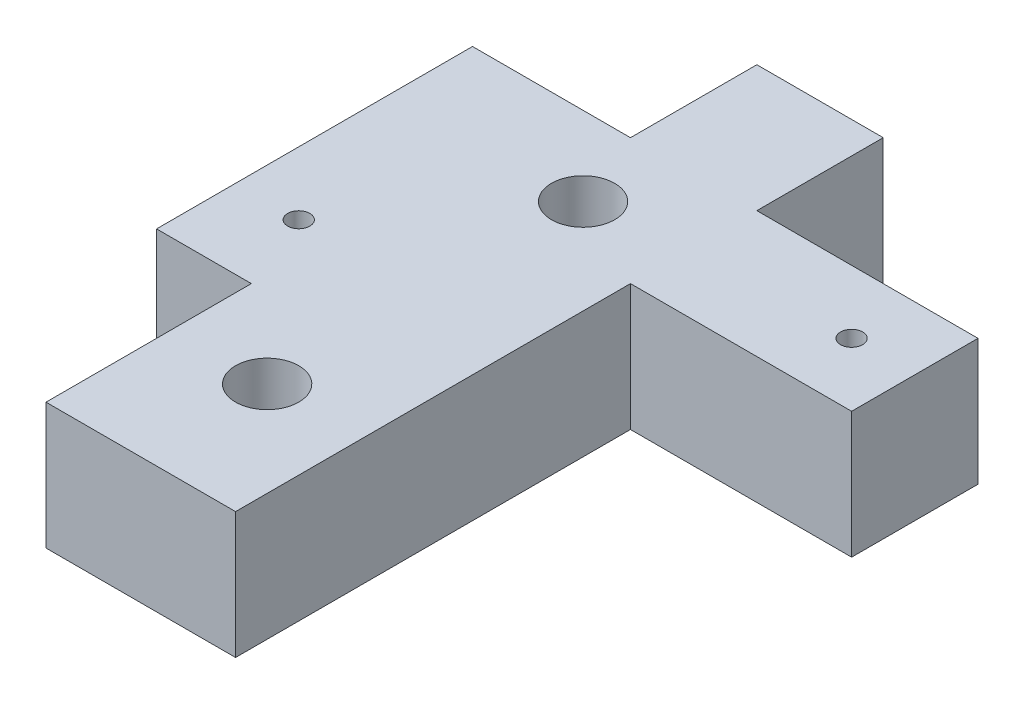
ISO-10303-21;
HEADER;
FILE_DESCRIPTION(('STEP AP214'),'2;1');
FILE_NAME('part.step','',(''),(''),'','','');
FILE_SCHEMA(('AUTOMOTIVE_DESIGN { 1 0 10303 214 1 1 1 1 }'));
ENDSEC;
DATA;
#1=APPLICATION_CONTEXT('core data for automotive mechanical design processes');
#2=APPLICATION_PROTOCOL_DEFINITION('international standard','automotive_design',2000,#1);
#3=PRODUCT_CONTEXT('',#1,'mechanical');
#4=PRODUCT('Part','Part','',(#3));
#5=PRODUCT_RELATED_PRODUCT_CATEGORY('part','',(#4));
#6=PRODUCT_DEFINITION_FORMATION('','',#4);
#7=PRODUCT_DEFINITION_CONTEXT('part definition',#1,'design');
#8=PRODUCT_DEFINITION('design','',#6,#7);
#9=PRODUCT_DEFINITION_SHAPE('','',#8);
#10=(LENGTH_UNIT() NAMED_UNIT(*) SI_UNIT(.MILLI.,.METRE.));
#11=(NAMED_UNIT(*) PLANE_ANGLE_UNIT() SI_UNIT($,.RADIAN.));
#12=(NAMED_UNIT(*) SI_UNIT($,.STERADIAN.) SOLID_ANGLE_UNIT());
#13=UNCERTAINTY_MEASURE_WITH_UNIT(LENGTH_MEASURE(1.E-05),#10,'distance_accuracy_value','');
#14=(GEOMETRIC_REPRESENTATION_CONTEXT(3) GLOBAL_UNCERTAINTY_ASSIGNED_CONTEXT((#13)) GLOBAL_UNIT_ASSIGNED_CONTEXT((#10,
#11,#12)) REPRESENTATION_CONTEXT('',''));
#15=CARTESIAN_POINT('',(0.,0.,0.));
#16=DIRECTION('',(0.,0.,1.));
#17=DIRECTION('',(1.,0.,0.));
#18=AXIS2_PLACEMENT_3D('',#15,#16,#17);
#19=CARTESIAN_POINT('',(0.,4.,0.));
#20=DIRECTION('',(0.,-1.,0.));
#21=DIRECTION('',(0.,0.,-1.));
#22=AXIS2_PLACEMENT_3D('',#19,#20,#21);
#23=PLANE('',#22);
#24=CARTESIAN_POINT('',(6.,4.,16.5));
#25=DIRECTION('',(0.,-1.,0.));
#26=DIRECTION('',(0.,0.,-1.));
#27=AXIS2_PLACEMENT_3D('',#24,#25,#26);
#28=CIRCLE('',#27,1.);
#29=CARTESIAN_POINT('',(6.,4.,15.5));
#30=VERTEX_POINT('',#29);
#31=EDGE_CURVE('E216',#30,#30,#28,.T.);
#32=ORIENTED_EDGE('',*,*,#31,.T.);
#33=EDGE_LOOP('',(#32));
#34=FACE_BOUND('',#33,.T.);
#35=CARTESIAN_POINT('',(6.,4.,6.5));
#36=DIRECTION('',(0.,-1.,0.));
#37=DIRECTION('',(0.,0.,-1.));
#38=AXIS2_PLACEMENT_3D('',#35,#36,#37);
#39=CIRCLE('',#38,1.);
#40=CARTESIAN_POINT('',(6.,4.,5.5));
#41=VERTEX_POINT('',#40);
#42=EDGE_CURVE('E220',#41,#41,#39,.T.);
#43=ORIENTED_EDGE('',*,*,#42,.T.);
#44=EDGE_LOOP('',(#43));
#45=FACE_BOUND('',#44,.T.);
#46=CARTESIAN_POINT('',(2.,4.,11.5));
#47=DIRECTION('',(0.,1.,0.));
#48=DIRECTION('',(0.,0.,1.));
#49=AXIS2_PLACEMENT_3D('',#46,#47,#48);
#50=CIRCLE('',#49,0.35);
#51=CARTESIAN_POINT('',(2.,4.,11.85));
#52=VERTEX_POINT('',#51);
#53=EDGE_CURVE('E229',#52,#52,#50,.T.);
#54=ORIENTED_EDGE('',*,*,#53,.F.);
#55=EDGE_LOOP('',(#54));
#56=FACE_BOUND('',#55,.T.);
#57=CARTESIAN_POINT('',(14.,4.,6.));
#58=DIRECTION('',(0.,1.,0.));
#59=DIRECTION('',(0.,0.,1.));
#60=AXIS2_PLACEMENT_3D('',#57,#58,#59);
#61=CIRCLE('',#60,0.349999999999999);
#62=CARTESIAN_POINT('',(14.,4.,6.35));
#63=VERTEX_POINT('',#62);
#64=EDGE_CURVE('E223',#63,#63,#61,.T.);
#65=ORIENTED_EDGE('',*,*,#64,.F.);
#66=EDGE_LOOP('',(#65));
#67=FACE_BOUND('',#66,.T.);
#68=DIRECTION('',(-1.,0.,0.));
#69=VECTOR('',#68,1.);
#70=CARTESIAN_POINT('',(0.,4.,7.99999999999999));
#71=LINE('',#70,#69);
#72=CARTESIAN_POINT('',(16.,4.,7.99999999999999));
#73=VERTEX_POINT('',#72);
#74=CARTESIAN_POINT('',(9.00000000000001,4.,7.99999999999999));
#75=VERTEX_POINT('',#74);
#76=EDGE_CURVE('E178',#73,#75,#71,.T.);
#77=ORIENTED_EDGE('',*,*,#76,.F.);
#78=DIRECTION('',(0.,0.,1.));
#79=VECTOR('',#78,1.);
#80=CARTESIAN_POINT('',(16.,4.,0.));
#81=LINE('',#80,#79);
#82=CARTESIAN_POINT('',(16.,4.,4.));
#83=VERTEX_POINT('',#82);
#84=EDGE_CURVE('E78',#83,#73,#81,.T.);
#85=ORIENTED_EDGE('',*,*,#84,.F.);
#86=DIRECTION('',(-1.,0.,0.));
#87=VECTOR('',#86,1.);
#88=CARTESIAN_POINT('',(0.,4.,4.));
#89=LINE('',#88,#87);
#90=CARTESIAN_POINT('',(9.00000000000001,4.,4.));
#91=VERTEX_POINT('',#90);
#92=EDGE_CURVE('E94',#83,#91,#89,.T.);
#93=ORIENTED_EDGE('',*,*,#92,.T.);
#94=DIRECTION('',(0.,0.,-1.00000000000004));
#95=VECTOR('',#94,1.);
#96=CARTESIAN_POINT('',(9.00000000000001,4.,0.));
#97=LINE('',#96,#95);
#98=CARTESIAN_POINT('',(9.00000000000001,4.,0.));
#99=VERTEX_POINT('',#98);
#100=EDGE_CURVE('E305',#91,#99,#97,.T.);
#101=ORIENTED_EDGE('',*,*,#100,.T.);
#102=DIRECTION('',(1.,0.,0.));
#103=VECTOR('',#102,1.);
#104=CARTESIAN_POINT('',(0.,4.,0.));
#105=LINE('',#104,#103);
#106=CARTESIAN_POINT('',(5.,4.,0.));
#107=VERTEX_POINT('',#106);
#108=EDGE_CURVE('E235',#107,#99,#105,.T.);
#109=ORIENTED_EDGE('',*,*,#108,.F.);
#110=DIRECTION('',(0.,0.,-1.00000000000005));
#111=VECTOR('',#110,1.);
#112=CARTESIAN_POINT('',(5.,4.,0.));
#113=LINE('',#112,#111);
#114=CARTESIAN_POINT('',(5.,4.,4.));
#115=VERTEX_POINT('',#114);
#116=EDGE_CURVE('E185',#115,#107,#113,.T.);
#117=ORIENTED_EDGE('',*,*,#116,.F.);
#118=DIRECTION('',(1.,0.,0.));
#119=VECTOR('',#118,1.);
#120=CARTESIAN_POINT('',(0.,4.,4.));
#121=LINE('',#120,#119);
#122=CARTESIAN_POINT('',(0.,4.,4.));
#123=VERTEX_POINT('',#122);
#124=EDGE_CURVE('E183',#123,#115,#121,.T.);
#125=ORIENTED_EDGE('',*,*,#124,.F.);
#126=DIRECTION('',(0.,0.,1.));
#127=VECTOR('',#126,1.);
#128=CARTESIAN_POINT('',(0.,4.,0.));
#129=LINE('',#128,#127);
#130=CARTESIAN_POINT('',(0.,4.,14.));
#131=VERTEX_POINT('',#130);
#132=EDGE_CURVE('E12',#123,#131,#129,.T.);
#133=ORIENTED_EDGE('',*,*,#132,.T.);
#134=DIRECTION('',(1.,0.,0.));
#135=VECTOR('',#134,1.);
#136=CARTESIAN_POINT('',(0.,4.,14.));
#137=LINE('',#136,#135);
#138=CARTESIAN_POINT('',(3.,4.,14.));
#139=VERTEX_POINT('',#138);
#140=EDGE_CURVE('E160',#131,#139,#137,.T.);
#141=ORIENTED_EDGE('',*,*,#140,.T.);
#142=DIRECTION('',(0.,0.,-1.00000000000001));
#143=VECTOR('',#142,1.);
#144=CARTESIAN_POINT('',(3.,4.,0.));
#145=LINE('',#144,#143);
#146=CARTESIAN_POINT('',(3.,4.,20.5000000000002));
#147=VERTEX_POINT('',#146);
#148=EDGE_CURVE('E169',#147,#139,#145,.T.);
#149=ORIENTED_EDGE('',*,*,#148,.F.);
#150=DIRECTION('',(1.,0.,0.));
#151=VECTOR('',#150,1.);
#152=CARTESIAN_POINT('',(0.,4.,20.5));
#153=LINE('',#152,#151);
#154=CARTESIAN_POINT('',(9.,4.,20.5000000000014));
#155=VERTEX_POINT('',#154);
#156=EDGE_CURVE('E343',#147,#155,#153,.T.);
#157=ORIENTED_EDGE('',*,*,#156,.T.);
#158=DIRECTION('',(0.,0.,-1.00000000000003));
#159=VECTOR('',#158,1.);
#160=CARTESIAN_POINT('',(9.00000000000001,4.,0.));
#161=LINE('',#160,#159);
#162=EDGE_CURVE('E345',#155,#75,#161,.T.);
#163=ORIENTED_EDGE('',*,*,#162,.T.);
#164=EDGE_LOOP('',(#77,#85,#93,#101,#109,#117,#125,#133,#141,#149,#157,#163));
#165=FACE_BOUND('',#164,.T.);
#166=ADVANCED_FACE('F69',(#34,#45,#56,#67,#165),#23,.F.);
#167=CARTESIAN_POINT('',(0.,0.,0.));
#168=DIRECTION('',(0.,-1.,0.));
#169=DIRECTION('',(0.,0.,-1.));
#170=AXIS2_PLACEMENT_3D('',#167,#168,#169);
#171=PLANE('',#170);
#172=CARTESIAN_POINT('',(6.,0.,16.5));
#173=DIRECTION('',(0.,-1.,0.));
#174=DIRECTION('',(0.,0.,-1.));
#175=AXIS2_PLACEMENT_3D('',#172,#173,#174);
#176=CIRCLE('',#175,1.5);
#177=CARTESIAN_POINT('',(6.,0.,15.));
#178=VERTEX_POINT('',#177);
#179=EDGE_CURVE('E206',#178,#178,#176,.T.);
#180=ORIENTED_EDGE('',*,*,#179,.F.);
#181=EDGE_LOOP('',(#180));
#182=FACE_BOUND('',#181,.T.);
#183=CARTESIAN_POINT('',(6.,0.,6.5));
#184=DIRECTION('',(0.,-1.,0.));
#185=DIRECTION('',(0.,0.,-1.));
#186=AXIS2_PLACEMENT_3D('',#183,#184,#185);
#187=CIRCLE('',#186,1.5);
#188=CARTESIAN_POINT('',(6.,0.,5.));
#189=VERTEX_POINT('',#188);
#190=EDGE_CURVE('E209',#189,#189,#187,.T.);
#191=ORIENTED_EDGE('',*,*,#190,.F.);
#192=EDGE_LOOP('',(#191));
#193=FACE_BOUND('',#192,.T.);
#194=CARTESIAN_POINT('',(2.,0.,11.5));
#195=DIRECTION('',(0.,1.,0.));
#196=DIRECTION('',(0.,0.,1.));
#197=AXIS2_PLACEMENT_3D('',#194,#195,#196);
#198=CIRCLE('',#197,0.35);
#199=CARTESIAN_POINT('',(2.,0.,11.85));
#200=VERTEX_POINT('',#199);
#201=EDGE_CURVE('E226',#200,#200,#198,.T.);
#202=ORIENTED_EDGE('',*,*,#201,.T.);
#203=EDGE_LOOP('',(#202));
#204=FACE_BOUND('',#203,.T.);
#205=CARTESIAN_POINT('',(14.,0.,6.));
#206=DIRECTION('',(0.,1.,0.));
#207=DIRECTION('',(0.,0.,1.));
#208=AXIS2_PLACEMENT_3D('',#205,#206,#207);
#209=CIRCLE('',#208,0.349999999999999);
#210=CARTESIAN_POINT('',(14.,0.,6.35));
#211=VERTEX_POINT('',#210);
#212=EDGE_CURVE('E219',#211,#211,#209,.T.);
#213=ORIENTED_EDGE('',*,*,#212,.T.);
#214=EDGE_LOOP('',(#213));
#215=FACE_BOUND('',#214,.T.);
#216=DIRECTION('',(0.,0.,1.));
#217=VECTOR('',#216,1.);
#218=CARTESIAN_POINT('',(16.,0.,0.));
#219=LINE('',#218,#217);
#220=CARTESIAN_POINT('',(16.,0.,4.));
#221=VERTEX_POINT('',#220);
#222=CARTESIAN_POINT('',(16.,0.,7.99999999999999));
#223=VERTEX_POINT('',#222);
#224=EDGE_CURVE('E242',#221,#223,#219,.T.);
#225=ORIENTED_EDGE('',*,*,#224,.T.);
#226=DIRECTION('',(-1.,0.,0.));
#227=VECTOR('',#226,1.);
#228=CARTESIAN_POINT('',(0.,0.,7.99999999999999));
#229=LINE('',#228,#227);
#230=CARTESIAN_POINT('',(9.00000000000001,0.,7.99999999999999));
#231=VERTEX_POINT('',#230);
#232=EDGE_CURVE('E170',#223,#231,#229,.T.);
#233=ORIENTED_EDGE('',*,*,#232,.T.);
#234=DIRECTION('',(0.,0.,-1.00000000000003));
#235=VECTOR('',#234,1.);
#236=CARTESIAN_POINT('',(9.00000000000001,0.,0.));
#237=LINE('',#236,#235);
#238=CARTESIAN_POINT('',(9.,0.,20.5000000000014));
#239=VERTEX_POINT('',#238);
#240=EDGE_CURVE('E324',#239,#231,#237,.T.);
#241=ORIENTED_EDGE('',*,*,#240,.F.);
#242=DIRECTION('',(1.,0.,0.));
#243=VECTOR('',#242,1.);
#244=CARTESIAN_POINT('',(0.,0.,20.5));
#245=LINE('',#244,#243);
#246=CARTESIAN_POINT('',(3.,0.,20.5000000000002));
#247=VERTEX_POINT('',#246);
#248=EDGE_CURVE('E317',#247,#239,#245,.T.);
#249=ORIENTED_EDGE('',*,*,#248,.F.);
#250=DIRECTION('',(0.,0.,-1.00000000000001));
#251=VECTOR('',#250,1.);
#252=CARTESIAN_POINT('',(3.,0.,0.));
#253=LINE('',#252,#251);
#254=CARTESIAN_POINT('',(3.,0.,14.));
#255=VERTEX_POINT('',#254);
#256=EDGE_CURVE('E314',#247,#255,#253,.T.);
#257=ORIENTED_EDGE('',*,*,#256,.T.);
#258=DIRECTION('',(1.,0.,0.));
#259=VECTOR('',#258,1.);
#260=CARTESIAN_POINT('',(0.,0.,14.));
#261=LINE('',#260,#259);
#262=CARTESIAN_POINT('',(0.,0.,14.));
#263=VERTEX_POINT('',#262);
#264=EDGE_CURVE('E313',#263,#255,#261,.T.);
#265=ORIENTED_EDGE('',*,*,#264,.F.);
#266=DIRECTION('',(0.,0.,1.));
#267=VECTOR('',#266,1.);
#268=CARTESIAN_POINT('',(0.,0.,0.));
#269=LINE('',#268,#267);
#270=CARTESIAN_POINT('',(0.,0.,4.));
#271=VERTEX_POINT('',#270);
#272=EDGE_CURVE('E177',#271,#263,#269,.T.);
#273=ORIENTED_EDGE('',*,*,#272,.F.);
#274=DIRECTION('',(1.,0.,0.));
#275=VECTOR('',#274,1.);
#276=CARTESIAN_POINT('',(0.,0.,4.));
#277=LINE('',#276,#275);
#278=CARTESIAN_POINT('',(5.,0.,4.));
#279=VERTEX_POINT('',#278);
#280=EDGE_CURVE('E86',#271,#279,#277,.T.);
#281=ORIENTED_EDGE('',*,*,#280,.T.);
#282=DIRECTION('',(0.,0.,-1.00000000000005));
#283=VECTOR('',#282,1.);
#284=CARTESIAN_POINT('',(5.,0.,0.));
#285=LINE('',#284,#283);
#286=CARTESIAN_POINT('',(5.,0.,0.));
#287=VERTEX_POINT('',#286);
#288=EDGE_CURVE('E194',#279,#287,#285,.T.);
#289=ORIENTED_EDGE('',*,*,#288,.T.);
#290=DIRECTION('',(1.,0.,0.));
#291=VECTOR('',#290,1.);
#292=CARTESIAN_POINT('',(0.,0.,0.));
#293=LINE('',#292,#291);
#294=CARTESIAN_POINT('',(9.00000000000001,0.,0.));
#295=VERTEX_POINT('',#294);
#296=EDGE_CURVE('E232',#287,#295,#293,.T.);
#297=ORIENTED_EDGE('',*,*,#296,.T.);
#298=DIRECTION('',(0.,0.,-1.00000000000004));
#299=VECTOR('',#298,1.);
#300=CARTESIAN_POINT('',(9.00000000000001,0.,0.));
#301=LINE('',#300,#299);
#302=CARTESIAN_POINT('',(9.00000000000001,0.,4.));
#303=VERTEX_POINT('',#302);
#304=EDGE_CURVE('E301',#303,#295,#301,.T.);
#305=ORIENTED_EDGE('',*,*,#304,.F.);
#306=DIRECTION('',(-1.,0.,0.));
#307=VECTOR('',#306,1.);
#308=CARTESIAN_POINT('',(0.,0.,4.));
#309=LINE('',#308,#307);
#310=EDGE_CURVE('E200',#221,#303,#309,.T.);
#311=ORIENTED_EDGE('',*,*,#310,.F.);
#312=EDGE_LOOP('',(#225,#233,#241,#249,#257,#265,#273,#281,#289,#297,#305,#311));
#313=FACE_BOUND('',#312,.T.);
#314=ADVANCED_FACE('F270',(#182,#193,#204,#215,#313),#171,.T.);
#315=CARTESIAN_POINT('',(0.,4.,0.));
#316=DIRECTION('',(0.,0.,-1.));
#317=DIRECTION('',(-1.,0.,0.));
#318=AXIS2_PLACEMENT_3D('',#315,#316,#317);
#319=PLANE('',#318);
#320=DIRECTION('',(0.,-1.,0.));
#321=VECTOR('',#320,1.);
#322=CARTESIAN_POINT('',(9.00000000000001,4.,0.));
#323=LINE('',#322,#321);
#324=EDGE_CURVE('E290',#99,#295,#323,.T.);
#325=ORIENTED_EDGE('',*,*,#324,.T.);
#326=ORIENTED_EDGE('',*,*,#296,.F.);
#327=DIRECTION('',(0.,-1.,0.));
#328=VECTOR('',#327,1.);
#329=CARTESIAN_POINT('',(5.,4.,0.));
#330=LINE('',#329,#328);
#331=EDGE_CURVE('E198',#107,#287,#330,.T.);
#332=ORIENTED_EDGE('',*,*,#331,.F.);
#333=ORIENTED_EDGE('',*,*,#108,.T.);
#334=EDGE_LOOP('',(#325,#326,#332,#333));
#335=FACE_BOUND('',#334,.T.);
#336=ADVANCED_FACE('F71',(#335),#319,.T.);
#337=CARTESIAN_POINT('',(0.,4.,0.));
#338=DIRECTION('',(1.,0.,0.));
#339=DIRECTION('',(0.,0.,-1.));
#340=AXIS2_PLACEMENT_3D('',#337,#338,#339);
#341=PLANE('',#340);
#342=ORIENTED_EDGE('',*,*,#272,.T.);
#343=DIRECTION('',(0.,-1.,0.));
#344=VECTOR('',#343,1.);
#345=CARTESIAN_POINT('',(0.,4.,14.));
#346=LINE('',#345,#344);
#347=EDGE_CURVE('E164',#131,#263,#346,.T.);
#348=ORIENTED_EDGE('',*,*,#347,.F.);
#349=ORIENTED_EDGE('',*,*,#132,.F.);
#350=DIRECTION('',(0.,-1.,0.));
#351=VECTOR('',#350,1.);
#352=CARTESIAN_POINT('',(0.,4.,4.));
#353=LINE('',#352,#351);
#354=EDGE_CURVE('E189',#123,#271,#353,.T.);
#355=ORIENTED_EDGE('',*,*,#354,.T.);
#356=EDGE_LOOP('',(#342,#348,#349,#355));
#357=FACE_BOUND('',#356,.T.);
#358=ADVANCED_FACE('F175',(#357),#341,.F.);
#359=CARTESIAN_POINT('',(16.,4.,0.));
#360=DIRECTION('',(1.,0.,0.));
#361=DIRECTION('',(0.,0.,-1.));
#362=AXIS2_PLACEMENT_3D('',#359,#360,#361);
#363=PLANE('',#362);
#364=ORIENTED_EDGE('',*,*,#84,.T.);
#365=DIRECTION('',(0.,-1.,0.));
#366=VECTOR('',#365,1.);
#367=CARTESIAN_POINT('',(16.,4.,7.99999999999999));
#368=LINE('',#367,#366);
#369=EDGE_CURVE('E215',#73,#223,#368,.T.);
#370=ORIENTED_EDGE('',*,*,#369,.T.);
#371=ORIENTED_EDGE('',*,*,#224,.F.);
#372=DIRECTION('',(0.,-1.,0.));
#373=VECTOR('',#372,1.);
#374=CARTESIAN_POINT('',(16.,4.,4.));
#375=LINE('',#374,#373);
#376=EDGE_CURVE('E295',#83,#221,#375,.T.);
#377=ORIENTED_EDGE('',*,*,#376,.F.);
#378=EDGE_LOOP('',(#364,#370,#371,#377));
#379=FACE_BOUND('',#378,.T.);
#380=ADVANCED_FACE('F256',(#379),#363,.T.);
#381=CARTESIAN_POINT('',(6.,4.,6.5));
#382=DIRECTION('',(0.,-1.,0.));
#383=DIRECTION('',(0.,0.,-1.));
#384=AXIS2_PLACEMENT_3D('',#381,#382,#383);
#385=CYLINDRICAL_SURFACE('',#384,1.);
#386=ORIENTED_EDGE('',*,*,#42,.F.);
#387=EDGE_LOOP('',(#386));
#388=FACE_BOUND('',#387,.T.);
#389=CARTESIAN_POINT('',(6.,2.,6.5));
#390=DIRECTION('',(0.,-1.,0.));
#391=DIRECTION('',(0.,0.,-1.));
#392=AXIS2_PLACEMENT_3D('',#389,#390,#391);
#393=CIRCLE('',#392,1.);
#394=CARTESIAN_POINT('',(6.,2.,5.5));
#395=VERTEX_POINT('',#394);
#396=EDGE_CURVE('E73',#395,#395,#393,.F.);
#397=ORIENTED_EDGE('',*,*,#396,.F.);
#398=EDGE_LOOP('',(#397));
#399=FACE_BOUND('',#398,.T.);
#400=ADVANCED_FACE('F253',(#388,#399),#385,.F.);
#401=CARTESIAN_POINT('',(6.,4.,16.5));
#402=DIRECTION('',(0.,-1.,0.));
#403=DIRECTION('',(0.,0.,-1.));
#404=AXIS2_PLACEMENT_3D('',#401,#402,#403);
#405=CYLINDRICAL_SURFACE('',#404,1.);
#406=ORIENTED_EDGE('',*,*,#31,.F.);
#407=EDGE_LOOP('',(#406));
#408=FACE_BOUND('',#407,.T.);
#409=CARTESIAN_POINT('',(6.,2.,16.5));
#410=DIRECTION('',(0.,-1.,0.));
#411=DIRECTION('',(0.,0.,-1.));
#412=AXIS2_PLACEMENT_3D('',#409,#410,#411);
#413=CIRCLE('',#412,1.);
#414=CARTESIAN_POINT('',(6.,2.,15.5));
#415=VERTEX_POINT('',#414);
#416=EDGE_CURVE('E205',#415,#415,#413,.F.);
#417=ORIENTED_EDGE('',*,*,#416,.F.);
#418=EDGE_LOOP('',(#417));
#419=FACE_BOUND('',#418,.T.);
#420=ADVANCED_FACE('F255',(#408,#419),#405,.F.);
#421=CARTESIAN_POINT('',(2.,4.,11.5));
#422=DIRECTION('',(0.,-1.,0.));
#423=DIRECTION('',(0.,0.,-1.));
#424=AXIS2_PLACEMENT_3D('',#421,#422,#423);
#425=CYLINDRICAL_SURFACE('',#424,0.35);
#426=ORIENTED_EDGE('',*,*,#53,.T.);
#427=EDGE_LOOP('',(#426));
#428=FACE_BOUND('',#427,.T.);
#429=ORIENTED_EDGE('',*,*,#201,.F.);
#430=EDGE_LOOP('',(#429));
#431=FACE_BOUND('',#430,.T.);
#432=ADVANCED_FACE('F263',(#428,#431),#425,.F.);
#433=CARTESIAN_POINT('',(14.,4.,6.));
#434=DIRECTION('',(0.,-1.,0.));
#435=DIRECTION('',(0.,0.,-1.));
#436=AXIS2_PLACEMENT_3D('',#433,#434,#435);
#437=CYLINDRICAL_SURFACE('',#436,0.349999999999999);
#438=ORIENTED_EDGE('',*,*,#64,.T.);
#439=EDGE_LOOP('',(#438));
#440=FACE_BOUND('',#439,.T.);
#441=ORIENTED_EDGE('',*,*,#212,.F.);
#442=EDGE_LOOP('',(#441));
#443=FACE_BOUND('',#442,.T.);
#444=ADVANCED_FACE('F379',(#440,#443),#437,.F.);
#445=CARTESIAN_POINT('',(6.,2.,16.5));
#446=DIRECTION('',(0.,-1.,0.));
#447=DIRECTION('',(0.,0.,-1.));
#448=AXIS2_PLACEMENT_3D('',#445,#446,#447);
#449=PLANE('',#448);
#450=CARTESIAN_POINT('',(6.,2.,16.5));
#451=DIRECTION('',(0.,-1.,0.));
#452=DIRECTION('',(0.,0.,-1.));
#453=AXIS2_PLACEMENT_3D('',#450,#451,#452);
#454=CIRCLE('',#453,1.5);
#455=CARTESIAN_POINT('',(6.,2.,15.));
#456=VERTEX_POINT('',#455);
#457=EDGE_CURVE('E202',#456,#456,#454,.T.);
#458=ORIENTED_EDGE('',*,*,#457,.T.);
#459=EDGE_LOOP('',(#458));
#460=FACE_BOUND('',#459,.T.);
#461=ORIENTED_EDGE('',*,*,#416,.T.);
#462=EDGE_LOOP('',(#461));
#463=FACE_BOUND('',#462,.T.);
#464=ADVANCED_FACE('F375',(#460,#463),#449,.T.);
#465=CARTESIAN_POINT('',(6.,2.,16.5));
#466=DIRECTION('',(0.,-1.,0.));
#467=DIRECTION('',(0.,0.,-1.));
#468=AXIS2_PLACEMENT_3D('',#465,#466,#467);
#469=CYLINDRICAL_SURFACE('',#468,1.5);
#470=ORIENTED_EDGE('',*,*,#457,.F.);
#471=EDGE_LOOP('',(#470));
#472=FACE_BOUND('',#471,.T.);
#473=ORIENTED_EDGE('',*,*,#179,.T.);
#474=EDGE_LOOP('',(#473));
#475=FACE_BOUND('',#474,.T.);
#476=ADVANCED_FACE('F378',(#472,#475),#469,.F.);
#477=CARTESIAN_POINT('',(6.,2.,6.5));
#478=DIRECTION('',(0.,-1.,0.));
#479=DIRECTION('',(0.,0.,-1.));
#480=AXIS2_PLACEMENT_3D('',#477,#478,#479);
#481=PLANE('',#480);
#482=CARTESIAN_POINT('',(6.,2.,6.5));
#483=DIRECTION('',(0.,-1.,0.));
#484=DIRECTION('',(0.,0.,-1.));
#485=AXIS2_PLACEMENT_3D('',#482,#483,#484);
#486=CIRCLE('',#485,1.5);
#487=CARTESIAN_POINT('',(6.,2.,5.));
#488=VERTEX_POINT('',#487);
#489=EDGE_CURVE('E212',#488,#488,#486,.T.);
#490=ORIENTED_EDGE('',*,*,#489,.T.);
#491=EDGE_LOOP('',(#490));
#492=FACE_BOUND('',#491,.T.);
#493=ORIENTED_EDGE('',*,*,#396,.T.);
#494=EDGE_LOOP('',(#493));
#495=FACE_BOUND('',#494,.T.);
#496=ADVANCED_FACE('F251',(#492,#495),#481,.T.);
#497=CARTESIAN_POINT('',(6.,2.,6.5));
#498=DIRECTION('',(0.,-1.,0.));
#499=DIRECTION('',(0.,0.,-1.));
#500=AXIS2_PLACEMENT_3D('',#497,#498,#499);
#501=CYLINDRICAL_SURFACE('',#500,1.5);
#502=ORIENTED_EDGE('',*,*,#489,.F.);
#503=EDGE_LOOP('',(#502));
#504=FACE_BOUND('',#503,.T.);
#505=ORIENTED_EDGE('',*,*,#190,.T.);
#506=EDGE_LOOP('',(#505));
#507=FACE_BOUND('',#506,.T.);
#508=ADVANCED_FACE('F365',(#504,#507),#501,.F.);
#509=CARTESIAN_POINT('',(0.,4.,4.));
#510=DIRECTION('',(0.,0.,1.));
#511=DIRECTION('',(1.,0.,0.));
#512=AXIS2_PLACEMENT_3D('',#509,#510,#511);
#513=PLANE('',#512);
#514=ORIENTED_EDGE('',*,*,#310,.T.);
#515=DIRECTION('',(0.,-1.,0.));
#516=VECTOR('',#515,1.);
#517=CARTESIAN_POINT('',(9.00000000000001,4.,4.));
#518=LINE('',#517,#516);
#519=EDGE_CURVE('E296',#91,#303,#518,.T.);
#520=ORIENTED_EDGE('',*,*,#519,.F.);
#521=ORIENTED_EDGE('',*,*,#92,.F.);
#522=ORIENTED_EDGE('',*,*,#376,.T.);
#523=EDGE_LOOP('',(#514,#520,#521,#522));
#524=FACE_BOUND('',#523,.T.);
#525=ADVANCED_FACE('F356',(#524),#513,.F.);
#526=CARTESIAN_POINT('',(9.00000000000001,4.,0.));
#527=DIRECTION('',(-1.,0.,0.));
#528=DIRECTION('',(0.,0.,1.));
#529=AXIS2_PLACEMENT_3D('',#526,#527,#528);
#530=PLANE('',#529);
#531=ORIENTED_EDGE('',*,*,#304,.T.);
#532=ORIENTED_EDGE('',*,*,#324,.F.);
#533=ORIENTED_EDGE('',*,*,#100,.F.);
#534=ORIENTED_EDGE('',*,*,#519,.T.);
#535=EDGE_LOOP('',(#531,#532,#533,#534));
#536=FACE_BOUND('',#535,.T.);
#537=ADVANCED_FACE('F357',(#536),#530,.F.);
#538=CARTESIAN_POINT('',(0.,4.,7.99999999999999));
#539=DIRECTION('',(0.,0.,1.));
#540=DIRECTION('',(1.,0.,0.));
#541=AXIS2_PLACEMENT_3D('',#538,#539,#540);
#542=PLANE('',#541);
#543=ORIENTED_EDGE('',*,*,#232,.F.);
#544=ORIENTED_EDGE('',*,*,#369,.F.);
#545=ORIENTED_EDGE('',*,*,#76,.T.);
#546=DIRECTION('',(0.,-1.,0.));
#547=VECTOR('',#546,1.);
#548=CARTESIAN_POINT('',(9.00000000000001,4.,7.99999999999999));
#549=LINE('',#548,#547);
#550=EDGE_CURVE('E331',#75,#231,#549,.T.);
#551=ORIENTED_EDGE('',*,*,#550,.T.);
#552=EDGE_LOOP('',(#543,#544,#545,#551));
#553=FACE_BOUND('',#552,.T.);
#554=ADVANCED_FACE('F351',(#553),#542,.T.);
#555=CARTESIAN_POINT('',(9.00000000000001,4.,0.));
#556=DIRECTION('',(-1.,0.,0.));
#557=DIRECTION('',(0.,0.,1.));
#558=AXIS2_PLACEMENT_3D('',#555,#556,#557);
#559=PLANE('',#558);
#560=ORIENTED_EDGE('',*,*,#240,.T.);
#561=ORIENTED_EDGE('',*,*,#550,.F.);
#562=ORIENTED_EDGE('',*,*,#162,.F.);
#563=DIRECTION('',(0.,-1.,0.));
#564=VECTOR('',#563,1.);
#565=CARTESIAN_POINT('',(9.,4.,20.5000000000014));
#566=LINE('',#565,#564);
#567=EDGE_CURVE('E333',#155,#239,#566,.T.);
#568=ORIENTED_EDGE('',*,*,#567,.T.);
#569=EDGE_LOOP('',(#560,#561,#562,#568));
#570=FACE_BOUND('',#569,.T.);
#571=ADVANCED_FACE('F353',(#570),#559,.F.);
#572=CARTESIAN_POINT('',(0.,4.,20.5));
#573=DIRECTION('',(0.,0.,-1.));
#574=DIRECTION('',(-1.,0.,0.));
#575=AXIS2_PLACEMENT_3D('',#572,#573,#574);
#576=PLANE('',#575);
#577=ORIENTED_EDGE('',*,*,#248,.T.);
#578=ORIENTED_EDGE('',*,*,#567,.F.);
#579=ORIENTED_EDGE('',*,*,#156,.F.);
#580=DIRECTION('',(0.,-1.,0.));
#581=VECTOR('',#580,1.);
#582=CARTESIAN_POINT('',(3.,4.,20.5000000000002));
#583=LINE('',#582,#581);
#584=EDGE_CURVE('E335',#147,#247,#583,.T.);
#585=ORIENTED_EDGE('',*,*,#584,.T.);
#586=EDGE_LOOP('',(#577,#578,#579,#585));
#587=FACE_BOUND('',#586,.T.);
#588=ADVANCED_FACE('F502',(#587),#576,.F.);
#589=CARTESIAN_POINT('',(3.,4.,0.));
#590=DIRECTION('',(-1.,0.,0.));
#591=DIRECTION('',(0.,0.,1.));
#592=AXIS2_PLACEMENT_3D('',#589,#590,#591);
#593=PLANE('',#592);
#594=ORIENTED_EDGE('',*,*,#256,.F.);
#595=ORIENTED_EDGE('',*,*,#584,.F.);
#596=ORIENTED_EDGE('',*,*,#148,.T.);
#597=DIRECTION('',(0.,-1.,0.));
#598=VECTOR('',#597,1.);
#599=CARTESIAN_POINT('',(3.,4.,14.));
#600=LINE('',#599,#598);
#601=EDGE_CURVE('E166',#139,#255,#600,.T.);
#602=ORIENTED_EDGE('',*,*,#601,.T.);
#603=EDGE_LOOP('',(#594,#595,#596,#602));
#604=FACE_BOUND('',#603,.T.);
#605=ADVANCED_FACE('F339',(#604),#593,.T.);
#606=CARTESIAN_POINT('',(0.,4.,14.));
#607=DIRECTION('',(0.,0.,-1.));
#608=DIRECTION('',(-1.,0.,0.));
#609=AXIS2_PLACEMENT_3D('',#606,#607,#608);
#610=PLANE('',#609);
#611=ORIENTED_EDGE('',*,*,#264,.T.);
#612=ORIENTED_EDGE('',*,*,#601,.F.);
#613=ORIENTED_EDGE('',*,*,#140,.F.);
#614=ORIENTED_EDGE('',*,*,#347,.T.);
#615=EDGE_LOOP('',(#611,#612,#613,#614));
#616=FACE_BOUND('',#615,.T.);
#617=ADVANCED_FACE('F163',(#616),#610,.F.);
#618=CARTESIAN_POINT('',(5.,4.,0.));
#619=DIRECTION('',(-1.,0.,0.));
#620=DIRECTION('',(0.,0.,1.));
#621=AXIS2_PLACEMENT_3D('',#618,#619,#620);
#622=PLANE('',#621);
#623=ORIENTED_EDGE('',*,*,#288,.F.);
#624=DIRECTION('',(0.,-1.,0.));
#625=VECTOR('',#624,1.);
#626=CARTESIAN_POINT('',(5.,4.,4.));
#627=LINE('',#626,#625);
#628=EDGE_CURVE('E187',#115,#279,#627,.T.);
#629=ORIENTED_EDGE('',*,*,#628,.F.);
#630=ORIENTED_EDGE('',*,*,#116,.T.);
#631=ORIENTED_EDGE('',*,*,#331,.T.);
#632=EDGE_LOOP('',(#623,#629,#630,#631));
#633=FACE_BOUND('',#632,.T.);
#634=ADVANCED_FACE('F304',(#633),#622,.T.);
#635=CARTESIAN_POINT('',(0.,4.,4.));
#636=DIRECTION('',(0.,0.,-1.));
#637=DIRECTION('',(-1.,0.,0.));
#638=AXIS2_PLACEMENT_3D('',#635,#636,#637);
#639=PLANE('',#638);
#640=ORIENTED_EDGE('',*,*,#280,.F.);
#641=ORIENTED_EDGE('',*,*,#354,.F.);
#642=ORIENTED_EDGE('',*,*,#124,.T.);
#643=ORIENTED_EDGE('',*,*,#628,.T.);
#644=EDGE_LOOP('',(#640,#641,#642,#643));
#645=FACE_BOUND('',#644,.T.);
#646=ADVANCED_FACE('F370',(#645),#639,.T.);
#647=CLOSED_SHELL('',(#166,#314,#336,#358,#380,#400,#420,#432,#444,#464,#476,#496,#508,#525,
#537,#554,#571,#588,#605,#617,#634,#646));
#648=MANIFOLD_SOLID_BREP('B2',#647);
#649=ADVANCED_BREP_SHAPE_REPRESENTATION('',(#18,#648),#14);
#650=SHAPE_DEFINITION_REPRESENTATION(#9,#649);
ENDSEC;
END-ISO-10303-21;
